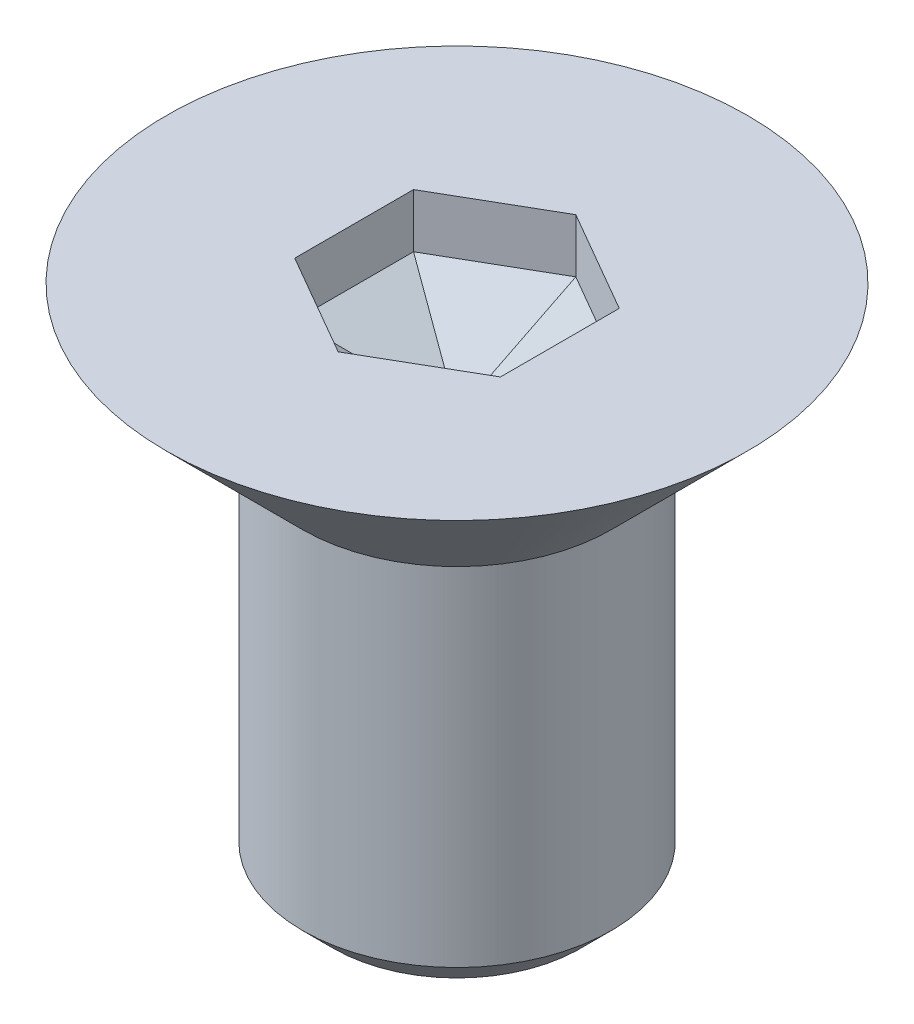
ISO-10303-21;
HEADER;
FILE_DESCRIPTION(('STEP AP214'),'2;1');
FILE_NAME('part.step','',(''),(''),'','','');
FILE_SCHEMA(('AUTOMOTIVE_DESIGN { 1 0 10303 214 1 1 1 1 }'));
ENDSEC;
DATA;
#1=APPLICATION_CONTEXT('core data for automotive mechanical design processes');
#2=APPLICATION_PROTOCOL_DEFINITION('international standard','automotive_design',2000,#1);
#3=PRODUCT_CONTEXT('',#1,'mechanical');
#4=PRODUCT('Part','Part','',(#3));
#5=PRODUCT_RELATED_PRODUCT_CATEGORY('part','',(#4));
#6=PRODUCT_DEFINITION_FORMATION('','',#4);
#7=PRODUCT_DEFINITION_CONTEXT('part definition',#1,'design');
#8=PRODUCT_DEFINITION('design','',#6,#7);
#9=PRODUCT_DEFINITION_SHAPE('','',#8);
#10=(LENGTH_UNIT() NAMED_UNIT(*) SI_UNIT(.MILLI.,.METRE.));
#11=(NAMED_UNIT(*) PLANE_ANGLE_UNIT() SI_UNIT($,.RADIAN.));
#12=(NAMED_UNIT(*) SI_UNIT($,.STERADIAN.) SOLID_ANGLE_UNIT());
#13=UNCERTAINTY_MEASURE_WITH_UNIT(LENGTH_MEASURE(1.E-05),#10,'distance_accuracy_value','');
#14=(GEOMETRIC_REPRESENTATION_CONTEXT(3) GLOBAL_UNCERTAINTY_ASSIGNED_CONTEXT((#13)) GLOBAL_UNIT_ASSIGNED_CONTEXT((#10,
#11,#12)) REPRESENTATION_CONTEXT('',''));
#15=CARTESIAN_POINT('',(0.,0.,0.));
#16=DIRECTION('',(0.,0.,1.));
#17=DIRECTION('',(1.,0.,0.));
#18=AXIS2_PLACEMENT_3D('',#15,#16,#17);
#19=CARTESIAN_POINT('',(0.,-3.72,0.));
#20=DIRECTION('',(0.,1.,0.));
#21=DIRECTION('',(0.,0.,1.));
#22=AXIS2_PLACEMENT_3D('',#19,#20,#21);
#23=CONICAL_SURFACE('',#22,1.93000000000004,0.785398163397443);
#24=CARTESIAN_POINT('',(0.,0.,0.));
#25=DIRECTION('',(0.,-1.,0.));
#26=DIRECTION('',(0.,0.,-1.));
#27=AXIS2_PLACEMENT_3D('',#24,#25,#26);
#28=CIRCLE('',#27,5.65);
#29=CARTESIAN_POINT('',(0.,0.,-5.65));
#30=VERTEX_POINT('',#29);
#31=EDGE_CURVE('E156',#30,#30,#28,.T.);
#32=ORIENTED_EDGE('',*,*,#31,.T.);
#33=EDGE_LOOP('',(#32));
#34=FACE_BOUND('',#33,.T.);
#35=CARTESIAN_POINT('',(0.,-2.65000000000003,0.));
#36=DIRECTION('',(0.,1.,0.));
#37=DIRECTION('',(0.,0.,1.));
#38=AXIS2_PLACEMENT_3D('',#35,#36,#37);
#39=CIRCLE('',#38,3.);
#40=CARTESIAN_POINT('',(0.,-2.65000000000003,3.));
#41=VERTEX_POINT('',#40);
#42=EDGE_CURVE('E151',#41,#41,#39,.T.);
#43=ORIENTED_EDGE('',*,*,#42,.T.);
#44=EDGE_LOOP('',(#43));
#45=FACE_BOUND('',#44,.T.);
#46=ADVANCED_FACE('F43',(#34,#45),#23,.T.);
#47=CARTESIAN_POINT('',(0.,0.,0.));
#48=DIRECTION('',(0.,1.,0.));
#49=DIRECTION('',(0.,0.,1.));
#50=AXIS2_PLACEMENT_3D('',#47,#48,#49);
#51=PLANE('',#50);
#52=DIRECTION('',(0.,0.,-1.));
#53=VECTOR('',#52,1.);
#54=CARTESIAN_POINT('',(2.,0.,1.15470053837925));
#55=LINE('',#54,#53);
#56=CARTESIAN_POINT('',(2.,0.,1.15470053837925));
#57=VERTEX_POINT('',#56);
#58=CARTESIAN_POINT('',(2.,0.,-1.15470053837925));
#59=VERTEX_POINT('',#58);
#60=EDGE_CURVE('E132',#57,#59,#55,.T.);
#61=ORIENTED_EDGE('',*,*,#60,.F.);
#62=DIRECTION('',(0.866025403784439,0.,-0.5));
#63=VECTOR('',#62,1.);
#64=CARTESIAN_POINT('',(0.,0.,2.30940107675851));
#65=LINE('',#64,#63);
#66=CARTESIAN_POINT('',(0.,0.,2.30940107675851));
#67=VERTEX_POINT('',#66);
#68=EDGE_CURVE('E148',#67,#57,#65,.T.);
#69=ORIENTED_EDGE('',*,*,#68,.F.);
#70=DIRECTION('',(0.866025403784438,0.,0.5));
#71=VECTOR('',#70,1.);
#72=CARTESIAN_POINT('',(-2.,0.,1.15470053837925));
#73=LINE('',#72,#71);
#74=CARTESIAN_POINT('',(-2.,0.,1.15470053837925));
#75=VERTEX_POINT('',#74);
#76=EDGE_CURVE('E137',#75,#67,#73,.T.);
#77=ORIENTED_EDGE('',*,*,#76,.F.);
#78=DIRECTION('',(0.,0.,1.));
#79=VECTOR('',#78,1.);
#80=CARTESIAN_POINT('',(-2.,0.,-1.15470053837925));
#81=LINE('',#80,#79);
#82=CARTESIAN_POINT('',(-2.,0.,-1.15470053837925));
#83=VERTEX_POINT('',#82);
#84=EDGE_CURVE('E136',#83,#75,#81,.T.);
#85=ORIENTED_EDGE('',*,*,#84,.F.);
#86=DIRECTION('',(-0.866025403784439,0.,0.5));
#87=VECTOR('',#86,1.);
#88=CARTESIAN_POINT('',(0.,0.,-2.3094010767585));
#89=LINE('',#88,#87);
#90=CARTESIAN_POINT('',(0.,0.,-2.3094010767585));
#91=VERTEX_POINT('',#90);
#92=EDGE_CURVE('E118',#91,#83,#89,.T.);
#93=ORIENTED_EDGE('',*,*,#92,.F.);
#94=DIRECTION('',(-0.866025403784439,0.,-0.5));
#95=VECTOR('',#94,1.);
#96=CARTESIAN_POINT('',(2.,0.,-1.15470053837925));
#97=LINE('',#96,#95);
#98=EDGE_CURVE('E129',#59,#91,#97,.T.);
#99=ORIENTED_EDGE('',*,*,#98,.F.);
#100=EDGE_LOOP('',(#61,#69,#77,#85,#93,#99));
#101=FACE_BOUND('',#100,.T.);
#102=ORIENTED_EDGE('',*,*,#31,.F.);
#103=EDGE_LOOP('',(#102));
#104=FACE_BOUND('',#103,.T.);
#105=ADVANCED_FACE('F133',(#101,#104),#51,.T.);
#106=CARTESIAN_POINT('',(0.,-10.,0.));
#107=DIRECTION('',(0.,1.,0.));
#108=DIRECTION('',(0.,0.,1.));
#109=AXIS2_PLACEMENT_3D('',#106,#107,#108);
#110=CYLINDRICAL_SURFACE('',#109,3.);
#111=CARTESIAN_POINT('',(0.,-9.4,0.));
#112=DIRECTION('',(0.,-1.,0.));
#113=DIRECTION('',(0.,0.,-1.));
#114=AXIS2_PLACEMENT_3D('',#111,#112,#113);
#115=CIRCLE('',#114,3.);
#116=CARTESIAN_POINT('',(0.,-9.4,3.));
#117=VERTEX_POINT('',#116);
#118=EDGE_CURVE('E11',#117,#117,#115,.F.);
#119=ORIENTED_EDGE('',*,*,#118,.T.);
#120=EDGE_LOOP('',(#119));
#121=FACE_BOUND('',#120,.T.);
#122=ORIENTED_EDGE('',*,*,#42,.F.);
#123=EDGE_LOOP('',(#122));
#124=FACE_BOUND('',#123,.T.);
#125=ADVANCED_FACE('F221',(#121,#124),#110,.T.);
#126=CARTESIAN_POINT('',(0.,-10.,0.));
#127=DIRECTION('',(0.,-1.,0.));
#128=DIRECTION('',(0.,0.,-1.));
#129=AXIS2_PLACEMENT_3D('',#126,#127,#128);
#130=PLANE('',#129);
#131=CARTESIAN_POINT('',(0.,-10.,0.));
#132=DIRECTION('',(0.,-1.,0.));
#133=DIRECTION('',(0.,0.,-1.));
#134=AXIS2_PLACEMENT_3D('',#131,#132,#133);
#135=CIRCLE('',#134,2.4);
#136=CARTESIAN_POINT('',(0.,-10.,2.4));
#137=VERTEX_POINT('',#136);
#138=EDGE_CURVE('E51',#137,#137,#135,.T.);
#139=ORIENTED_EDGE('',*,*,#138,.T.);
#140=EDGE_LOOP('',(#139));
#141=FACE_BOUND('',#140,.T.);
#142=ADVANCED_FACE('F204',(#141),#130,.T.);
#143=CARTESIAN_POINT('',(2.,-2.2,1.15470053837925));
#144=DIRECTION('',(1.,0.,0.));
#145=DIRECTION('',(0.,0.,-1.));
#146=AXIS2_PLACEMENT_3D('',#143,#144,#145);
#147=PLANE('',#146);
#148=DIRECTION('',(0.,1.,0.));
#149=VECTOR('',#148,1.);
#150=CARTESIAN_POINT('',(2.,-2.2,-1.15470053837925));
#151=LINE('',#150,#149);
#152=CARTESIAN_POINT('',(2.,-1.04726224783862,-1.15470053837925));
#153=VERTEX_POINT('',#152);
#154=EDGE_CURVE('E121',#153,#59,#151,.T.);
#155=ORIENTED_EDGE('',*,*,#154,.F.);
#156=DIRECTION('',(0.,0.,1.));
#157=VECTOR('',#156,1.);
#158=CARTESIAN_POINT('',(2.,-1.04726224783862,1.15470053837925));
#159=LINE('',#158,#157);
#160=CARTESIAN_POINT('',(2.,-1.04726224783862,1.15470053837925));
#161=VERTEX_POINT('',#160);
#162=EDGE_CURVE('E61',#153,#161,#159,.T.);
#163=ORIENTED_EDGE('',*,*,#162,.T.);
#164=DIRECTION('',(0.,1.,0.));
#165=VECTOR('',#164,1.);
#166=CARTESIAN_POINT('',(2.,-2.2,1.15470053837925));
#167=LINE('',#166,#165);
#168=EDGE_CURVE('E150',#161,#57,#167,.T.);
#169=ORIENTED_EDGE('',*,*,#168,.T.);
#170=ORIENTED_EDGE('',*,*,#60,.T.);
#171=EDGE_LOOP('',(#155,#163,#169,#170));
#172=FACE_BOUND('',#171,.T.);
#173=ADVANCED_FACE('F278',(#172),#147,.F.);
#174=CARTESIAN_POINT('',(0.,-2.2,2.30940107675851));
#175=DIRECTION('',(0.5,0.,0.866025403784439));
#176=DIRECTION('',(0.866025403784439,0.,-0.5));
#177=AXIS2_PLACEMENT_3D('',#174,#175,#176);
#178=PLANE('',#177);
#179=ORIENTED_EDGE('',*,*,#168,.F.);
#180=DIRECTION('',(-0.866025403784439,0.,0.5));
#181=VECTOR('',#180,1.);
#182=CARTESIAN_POINT('',(0.,-1.04726224783862,2.30940107675851));
#183=LINE('',#182,#181);
#184=CARTESIAN_POINT('',(0.,-1.04726224783862,2.30940107675851));
#185=VERTEX_POINT('',#184);
#186=EDGE_CURVE('E185',#161,#185,#183,.T.);
#187=ORIENTED_EDGE('',*,*,#186,.T.);
#188=DIRECTION('',(0.,1.,0.));
#189=VECTOR('',#188,1.);
#190=CARTESIAN_POINT('',(0.,-2.2,2.30940107675851));
#191=LINE('',#190,#189);
#192=EDGE_CURVE('E152',#185,#67,#191,.T.);
#193=ORIENTED_EDGE('',*,*,#192,.T.);
#194=ORIENTED_EDGE('',*,*,#68,.T.);
#195=EDGE_LOOP('',(#179,#187,#193,#194));
#196=FACE_BOUND('',#195,.T.);
#197=ADVANCED_FACE('F262',(#196),#178,.F.);
#198=CARTESIAN_POINT('',(-2.,-2.2,1.15470053837925));
#199=DIRECTION('',(-0.5,0.,0.866025403784438));
#200=DIRECTION('',(0.866025403784439,0.,0.5));
#201=AXIS2_PLACEMENT_3D('',#198,#199,#200);
#202=PLANE('',#201);
#203=ORIENTED_EDGE('',*,*,#192,.F.);
#204=DIRECTION('',(-0.866025403784439,0.,-0.5));
#205=VECTOR('',#204,1.);
#206=CARTESIAN_POINT('',(-2.,-1.04726224783862,1.15470053837925));
#207=LINE('',#206,#205);
#208=CARTESIAN_POINT('',(-2.,-1.04726224783862,1.15470053837925));
#209=VERTEX_POINT('',#208);
#210=EDGE_CURVE('E176',#185,#209,#207,.T.);
#211=ORIENTED_EDGE('',*,*,#210,.T.);
#212=DIRECTION('',(0.,1.,0.));
#213=VECTOR('',#212,1.);
#214=CARTESIAN_POINT('',(-2.,-2.2,1.15470053837925));
#215=LINE('',#214,#213);
#216=EDGE_CURVE('E153',#209,#75,#215,.T.);
#217=ORIENTED_EDGE('',*,*,#216,.T.);
#218=ORIENTED_EDGE('',*,*,#76,.T.);
#219=EDGE_LOOP('',(#203,#211,#217,#218));
#220=FACE_BOUND('',#219,.T.);
#221=ADVANCED_FACE('F265',(#220),#202,.F.);
#222=CARTESIAN_POINT('',(-2.,-2.2,-1.15470053837925));
#223=DIRECTION('',(-1.,0.,0.));
#224=DIRECTION('',(0.,0.,1.));
#225=AXIS2_PLACEMENT_3D('',#222,#223,#224);
#226=PLANE('',#225);
#227=ORIENTED_EDGE('',*,*,#216,.F.);
#228=DIRECTION('',(0.,0.,-1.));
#229=VECTOR('',#228,1.);
#230=CARTESIAN_POINT('',(-2.,-1.04726224783862,-1.15470053837925));
#231=LINE('',#230,#229);
#232=CARTESIAN_POINT('',(-2.,-1.04726224783862,-1.15470053837925));
#233=VERTEX_POINT('',#232);
#234=EDGE_CURVE('E177',#209,#233,#231,.T.);
#235=ORIENTED_EDGE('',*,*,#234,.T.);
#236=DIRECTION('',(0.,1.,0.));
#237=VECTOR('',#236,1.);
#238=CARTESIAN_POINT('',(-2.,-2.2,-1.15470053837925));
#239=LINE('',#238,#237);
#240=EDGE_CURVE('E124',#233,#83,#239,.T.);
#241=ORIENTED_EDGE('',*,*,#240,.T.);
#242=ORIENTED_EDGE('',*,*,#84,.T.);
#243=EDGE_LOOP('',(#227,#235,#241,#242));
#244=FACE_BOUND('',#243,.T.);
#245=ADVANCED_FACE('F274',(#244),#226,.F.);
#246=CARTESIAN_POINT('',(0.,-2.2,-2.3094010767585));
#247=DIRECTION('',(-0.5,0.,-0.866025403784439));
#248=DIRECTION('',(-0.866025403784439,0.,0.5));
#249=AXIS2_PLACEMENT_3D('',#246,#247,#248);
#250=PLANE('',#249);
#251=ORIENTED_EDGE('',*,*,#240,.F.);
#252=DIRECTION('',(0.866025403784439,0.,-0.5));
#253=VECTOR('',#252,1.);
#254=CARTESIAN_POINT('',(0.,-1.04726224783862,-2.3094010767585));
#255=LINE('',#254,#253);
#256=CARTESIAN_POINT('',(0.,-1.04726224783862,-2.3094010767585));
#257=VERTEX_POINT('',#256);
#258=EDGE_CURVE('E125',#233,#257,#255,.T.);
#259=ORIENTED_EDGE('',*,*,#258,.T.);
#260=DIRECTION('',(0.,1.,0.));
#261=VECTOR('',#260,1.);
#262=CARTESIAN_POINT('',(0.,-2.2,-2.3094010767585));
#263=LINE('',#262,#261);
#264=EDGE_CURVE('E112',#257,#91,#263,.T.);
#265=ORIENTED_EDGE('',*,*,#264,.T.);
#266=ORIENTED_EDGE('',*,*,#92,.T.);
#267=EDGE_LOOP('',(#251,#259,#265,#266));
#268=FACE_BOUND('',#267,.T.);
#269=ADVANCED_FACE('F120',(#268),#250,.F.);
#270=CARTESIAN_POINT('',(2.,-2.2,-1.15470053837925));
#271=DIRECTION('',(0.5,0.,-0.866025403784438));
#272=DIRECTION('',(-0.866025403784439,0.,-0.5));
#273=AXIS2_PLACEMENT_3D('',#270,#271,#272);
#274=PLANE('',#273);
#275=ORIENTED_EDGE('',*,*,#264,.F.);
#276=DIRECTION('',(0.866025403784439,0.,0.5));
#277=VECTOR('',#276,1.);
#278=CARTESIAN_POINT('',(2.,-1.04726224783862,-1.15470053837925));
#279=LINE('',#278,#277);
#280=EDGE_CURVE('E59',#257,#153,#279,.T.);
#281=ORIENTED_EDGE('',*,*,#280,.T.);
#282=ORIENTED_EDGE('',*,*,#154,.T.);
#283=ORIENTED_EDGE('',*,*,#98,.T.);
#284=EDGE_LOOP('',(#275,#281,#282,#283));
#285=FACE_BOUND('',#284,.T.);
#286=ADVANCED_FACE('F127',(#285),#274,.F.);
#287=CARTESIAN_POINT('',(0.,-2.2,0.));
#288=DIRECTION('',(0.,1.,0.));
#289=DIRECTION('',(0.,0.,1.));
#290=AXIS2_PLACEMENT_3D('',#287,#288,#289);
#291=PLANE('',#290);
#292=DIRECTION('',(0.,0.,1.));
#293=VECTOR('',#292,1.);
#294=CARTESIAN_POINT('',(-0.00339964545371246,-2.2,0.));
#295=LINE('',#294,#293);
#296=CARTESIAN_POINT('',(-0.00339964545371252,-2.2,-0.00196278621784765));
#297=VERTEX_POINT('',#296);
#298=CARTESIAN_POINT('',(-0.00339964545371246,-2.2,0.00196278621785234));
#299=VERTEX_POINT('',#298);
#300=EDGE_CURVE('E171',#297,#299,#295,.T.);
#301=ORIENTED_EDGE('',*,*,#300,.T.);
#302=DIRECTION('',(0.866025403784439,0.,0.5));
#303=VECTOR('',#302,1.);
#304=CARTESIAN_POINT('',(-0.00169982272685715,-2.2,0.00294417932677686));
#305=LINE('',#304,#303);
#306=CARTESIAN_POINT('',(0.,-2.2,0.003925572435702));
#307=VERTEX_POINT('',#306);
#308=EDGE_CURVE('E173',#299,#307,#305,.T.);
#309=ORIENTED_EDGE('',*,*,#308,.T.);
#310=DIRECTION('',(0.866025403784439,0.,-0.5));
#311=VECTOR('',#310,1.);
#312=CARTESIAN_POINT('',(0.00169982272685672,-2.2,0.00294417932677611));
#313=LINE('',#312,#311);
#314=CARTESIAN_POINT('',(0.00339964545371203,-2.2,0.00196278621785155));
#315=VERTEX_POINT('',#314);
#316=EDGE_CURVE('E170',#307,#315,#313,.T.);
#317=ORIENTED_EDGE('',*,*,#316,.T.);
#318=DIRECTION('',(0.,0.,-1.));
#319=VECTOR('',#318,1.);
#320=CARTESIAN_POINT('',(0.00339964545371203,-2.2,0.));
#321=LINE('',#320,#319);
#322=CARTESIAN_POINT('',(0.00339964545371203,-2.2,-0.00196278621784983));
#323=VERTEX_POINT('',#322);
#324=EDGE_CURVE('E164',#315,#323,#321,.T.);
#325=ORIENTED_EDGE('',*,*,#324,.T.);
#326=DIRECTION('',(-0.866025403784439,0.,-0.5));
#327=VECTOR('',#326,1.);
#328=CARTESIAN_POINT('',(0.00169982272685596,-2.2,-0.0029441793267748));
#329=LINE('',#328,#327);
#330=CARTESIAN_POINT('',(0.,-2.2,-0.00392557243569888));
#331=VERTEX_POINT('',#330);
#332=EDGE_CURVE('E163',#323,#331,#329,.T.);
#333=ORIENTED_EDGE('',*,*,#332,.T.);
#334=DIRECTION('',(-0.866025403784439,0.,0.5));
#335=VECTOR('',#334,1.);
#336=CARTESIAN_POINT('',(-0.00169982272685515,-2.2,-0.00294417932677339));
#337=LINE('',#336,#335);
#338=EDGE_CURVE('E169',#331,#297,#337,.T.);
#339=ORIENTED_EDGE('',*,*,#338,.T.);
#340=EDGE_LOOP('',(#301,#309,#317,#325,#333,#339));
#341=FACE_BOUND('',#340,.T.);
#342=ADVANCED_FACE('F244',(#341),#291,.T.);
#343=CARTESIAN_POINT('',(0.00169982272685596,-2.2,-0.0029441793267748));
#344=DIRECTION('',(0.249999999999997,-0.866025403784442,-0.433012701892215));
#345=DIRECTION('',(-0.866025403784439,0.,-0.5));
#346=AXIS2_PLACEMENT_3D('',#343,#344,#345);
#347=PLANE('',#346);
#348=DIRECTION('',(0.774596669241486,0.447213595499953,-0.447213595499959));
#349=VECTOR('',#348,1.);
#350=CARTESIAN_POINT('',(0.00271971636296966,-2.20039255724357,-0.00157022897427984));
#351=LINE('',#350,#349);
#352=EDGE_CURVE('E196',#153,#323,#351,.F.);
#353=ORIENTED_EDGE('',*,*,#352,.F.);
#354=ORIENTED_EDGE('',*,*,#280,.F.);
#355=DIRECTION('',(0.,-0.447213595499953,0.894427190999919));
#356=VECTOR('',#355,1.);
#357=CARTESIAN_POINT('',(0.,-2.20039255724357,-0.00314045794855846));
#358=LINE('',#357,#356);
#359=EDGE_CURVE('E198',#331,#257,#358,.F.);
#360=ORIENTED_EDGE('',*,*,#359,.F.);
#361=ORIENTED_EDGE('',*,*,#332,.F.);
#362=EDGE_LOOP('',(#353,#354,#360,#361));
#363=FACE_BOUND('',#362,.T.);
#364=ADVANCED_FACE('F245',(#363),#347,.F.);
#365=CARTESIAN_POINT('',(-0.00169982272685515,-2.2,-0.00294417932677339));
#366=DIRECTION('',(-0.249999999999997,-0.866025403784442,-0.433012701892214));
#367=DIRECTION('',(-0.866025403784439,0.,0.5));
#368=AXIS2_PLACEMENT_3D('',#365,#366,#367);
#369=PLANE('',#368);
#370=ORIENTED_EDGE('',*,*,#359,.T.);
#371=ORIENTED_EDGE('',*,*,#258,.F.);
#372=DIRECTION('',(0.774596669241486,-0.447213595499953,0.447213595499959));
#373=VECTOR('',#372,1.);
#374=CARTESIAN_POINT('',(-0.00271971636297083,-2.20039255724357,-0.00157022897427814));
#375=LINE('',#374,#373);
#376=EDGE_CURVE('E192',#297,#233,#375,.F.);
#377=ORIENTED_EDGE('',*,*,#376,.F.);
#378=ORIENTED_EDGE('',*,*,#338,.F.);
#379=EDGE_LOOP('',(#370,#371,#377,#378));
#380=FACE_BOUND('',#379,.T.);
#381=ADVANCED_FACE('F237',(#380),#369,.F.);
#382=CARTESIAN_POINT('',(0.00339964545371203,-2.2,0.));
#383=DIRECTION('',(0.499999999999994,-0.866025403784442,0.));
#384=DIRECTION('',(0.,0.,-1.));
#385=AXIS2_PLACEMENT_3D('',#382,#383,#384);
#386=PLANE('',#385);
#387=ORIENTED_EDGE('',*,*,#352,.T.);
#388=ORIENTED_EDGE('',*,*,#324,.F.);
#389=DIRECTION('',(0.774596669241486,0.447213595499953,0.44721359549996));
#390=VECTOR('',#389,1.);
#391=CARTESIAN_POINT('',(0.00271971636296988,-2.20039255724357,0.00157022897428159));
#392=LINE('',#391,#390);
#393=EDGE_CURVE('E188',#161,#315,#392,.F.);
#394=ORIENTED_EDGE('',*,*,#393,.F.);
#395=ORIENTED_EDGE('',*,*,#162,.F.);
#396=EDGE_LOOP('',(#387,#388,#394,#395));
#397=FACE_BOUND('',#396,.T.);
#398=ADVANCED_FACE('F232',(#397),#386,.F.);
#399=CARTESIAN_POINT('',(-0.00339964545371246,-2.2,0.));
#400=DIRECTION('',(-0.499999999999994,-0.866025403784442,0.));
#401=DIRECTION('',(0.,0.,1.));
#402=AXIS2_PLACEMENT_3D('',#399,#400,#401);
#403=PLANE('',#402);
#404=ORIENTED_EDGE('',*,*,#376,.T.);
#405=ORIENTED_EDGE('',*,*,#234,.F.);
#406=DIRECTION('',(0.774596669241486,-0.447213595499953,-0.447213595499959));
#407=VECTOR('',#406,1.);
#408=CARTESIAN_POINT('',(-0.00271971636297029,-2.20039255724357,0.00157022897428221));
#409=LINE('',#408,#407);
#410=EDGE_CURVE('E189',#299,#209,#409,.F.);
#411=ORIENTED_EDGE('',*,*,#410,.F.);
#412=ORIENTED_EDGE('',*,*,#300,.F.);
#413=EDGE_LOOP('',(#404,#405,#411,#412));
#414=FACE_BOUND('',#413,.T.);
#415=ADVANCED_FACE('F233',(#414),#403,.F.);
#416=CARTESIAN_POINT('',(0.00169982272685667,-2.2,0.00294417932677602));
#417=DIRECTION('',(0.249999999999997,-0.866025403784442,0.433012701892214));
#418=DIRECTION('',(0.866025403784439,0.,-0.5));
#419=AXIS2_PLACEMENT_3D('',#416,#417,#418);
#420=PLANE('',#419);
#421=ORIENTED_EDGE('',*,*,#393,.T.);
#422=ORIENTED_EDGE('',*,*,#316,.F.);
#423=DIRECTION('',(0.,0.447213595499953,0.894427190999919));
#424=VECTOR('',#423,1.);
#425=CARTESIAN_POINT('',(0.,-2.20039255724357,0.00314045794856169));
#426=LINE('',#425,#424);
#427=EDGE_CURVE('E187',#185,#307,#426,.F.);
#428=ORIENTED_EDGE('',*,*,#427,.F.);
#429=ORIENTED_EDGE('',*,*,#186,.F.);
#430=EDGE_LOOP('',(#421,#422,#428,#429));
#431=FACE_BOUND('',#430,.T.);
#432=ADVANCED_FACE('F212',(#431),#420,.F.);
#433=CARTESIAN_POINT('',(-0.00169982272685705,-2.2,0.00294417932677668));
#434=DIRECTION('',(-0.249999999999997,-0.866025403784442,0.433012701892214));
#435=DIRECTION('',(0.866025403784439,0.,0.5));
#436=AXIS2_PLACEMENT_3D('',#433,#434,#435);
#437=PLANE('',#436);
#438=ORIENTED_EDGE('',*,*,#410,.T.);
#439=ORIENTED_EDGE('',*,*,#210,.F.);
#440=ORIENTED_EDGE('',*,*,#427,.T.);
#441=ORIENTED_EDGE('',*,*,#308,.F.);
#442=EDGE_LOOP('',(#438,#439,#440,#441));
#443=FACE_BOUND('',#442,.T.);
#444=ADVANCED_FACE('F210',(#443),#437,.F.);
#445=CARTESIAN_POINT('',(0.,-10.,0.));
#446=DIRECTION('',(0.,1.,0.));
#447=DIRECTION('',(0.,0.,1.));
#448=AXIS2_PLACEMENT_3D('',#445,#446,#447);
#449=CONICAL_SURFACE('',#448,2.4,0.785398163397447);
#450=CARTESIAN_POINT('',(0.,-9.4,3.));
#451=CARTESIAN_POINT('',(0.,-9.40625,2.99375));
#452=CARTESIAN_POINT('',(0.,-9.4125,2.9875));
#453=CARTESIAN_POINT('',(0.,-9.425,2.975));
#454=CARTESIAN_POINT('',(0.,-9.43125,2.96875));
#455=CARTESIAN_POINT('',(0.,-9.44375,2.95625));
#456=CARTESIAN_POINT('',(0.,-9.45,2.95));
#457=CARTESIAN_POINT('',(0.,-9.4625,2.9375));
#458=CARTESIAN_POINT('',(0.,-9.46875,2.93125));
#459=CARTESIAN_POINT('',(0.,-9.48125,2.91875));
#460=CARTESIAN_POINT('',(0.,-9.4875,2.9125));
#461=CARTESIAN_POINT('',(0.,-9.5,2.9));
#462=CARTESIAN_POINT('',(0.,-9.50625,2.89375));
#463=CARTESIAN_POINT('',(0.,-9.51875,2.88125));
#464=CARTESIAN_POINT('',(0.,-9.525,2.875));
#465=CARTESIAN_POINT('',(0.,-9.5375,2.8625));
#466=CARTESIAN_POINT('',(0.,-9.54375,2.85625));
#467=CARTESIAN_POINT('',(0.,-9.55625,2.84375));
#468=CARTESIAN_POINT('',(0.,-9.5625,2.8375));
#469=CARTESIAN_POINT('',(0.,-9.575,2.825));
#470=CARTESIAN_POINT('',(0.,-9.58125,2.81875));
#471=CARTESIAN_POINT('',(0.,-9.59375,2.80625));
#472=CARTESIAN_POINT('',(0.,-9.6,2.8));
#473=CARTESIAN_POINT('',(0.,-9.6125,2.7875));
#474=CARTESIAN_POINT('',(0.,-9.61875,2.78125));
#475=CARTESIAN_POINT('',(0.,-9.63125,2.76875));
#476=CARTESIAN_POINT('',(0.,-9.6375,2.7625));
#477=CARTESIAN_POINT('',(0.,-9.65,2.75));
#478=CARTESIAN_POINT('',(0.,-9.65625,2.74375));
#479=CARTESIAN_POINT('',(0.,-9.66875,2.73125));
#480=CARTESIAN_POINT('',(0.,-9.675,2.725));
#481=CARTESIAN_POINT('',(0.,-9.6875,2.7125));
#482=CARTESIAN_POINT('',(0.,-9.69375,2.70625));
#483=CARTESIAN_POINT('',(0.,-9.70625,2.69375));
#484=CARTESIAN_POINT('',(0.,-9.7125,2.6875));
#485=CARTESIAN_POINT('',(0.,-9.725,2.675));
#486=CARTESIAN_POINT('',(0.,-9.73125,2.66875));
#487=CARTESIAN_POINT('',(0.,-9.74375,2.65625));
#488=CARTESIAN_POINT('',(0.,-9.75,2.65));
#489=CARTESIAN_POINT('',(0.,-9.7625,2.6375));
#490=CARTESIAN_POINT('',(0.,-9.76875,2.63125));
#491=CARTESIAN_POINT('',(0.,-9.78125,2.61875));
#492=CARTESIAN_POINT('',(0.,-9.7875,2.6125));
#493=CARTESIAN_POINT('',(0.,-9.8,2.6));
#494=CARTESIAN_POINT('',(0.,-9.80625,2.59375));
#495=CARTESIAN_POINT('',(0.,-9.81875,2.58125));
#496=CARTESIAN_POINT('',(0.,-9.825,2.575));
#497=CARTESIAN_POINT('',(0.,-9.8375,2.5625));
#498=CARTESIAN_POINT('',(0.,-9.84375,2.55625));
#499=CARTESIAN_POINT('',(0.,-9.85625,2.54375));
#500=CARTESIAN_POINT('',(0.,-9.8625,2.5375));
#501=CARTESIAN_POINT('',(0.,-9.875,2.525));
#502=CARTESIAN_POINT('',(0.,-9.88125,2.51875));
#503=CARTESIAN_POINT('',(0.,-9.89375,2.50625));
#504=CARTESIAN_POINT('',(0.,-9.9,2.5));
#505=CARTESIAN_POINT('',(0.,-9.9125,2.4875));
#506=CARTESIAN_POINT('',(0.,-9.91875,2.48125));
#507=CARTESIAN_POINT('',(0.,-9.93125,2.46875));
#508=CARTESIAN_POINT('',(0.,-9.9375,2.4625));
#509=CARTESIAN_POINT('',(0.,-9.95,2.45));
#510=CARTESIAN_POINT('',(0.,-9.95625,2.44375));
#511=CARTESIAN_POINT('',(0.,-9.96875,2.43125));
#512=CARTESIAN_POINT('',(0.,-9.975,2.425));
#513=CARTESIAN_POINT('',(0.,-9.9875,2.4125));
#514=CARTESIAN_POINT('',(0.,-9.99375,2.40625));
#515=CARTESIAN_POINT('',(0.,-10.,2.4));
#516=B_SPLINE_CURVE_WITH_KNOTS('',3,(#450,#451,#452,#453,#454,#455,#456,#457,#458,#459,#460,
#461,#462,#463,#464,#465,#466,#467,#468,#469,#470,#471,#472,#473,#474,#475,#476,#477,#478,#479,
#480,#481,#482,#483,#484,#485,#486,#487,#488,#489,#490,#491,#492,#493,#494,#495,#496,#497,#498,
#499,#500,#501,#502,#503,#504,#505,#506,#507,#508,#509,#510,#511,#512,#513,#514,#515),
.UNSPECIFIED.,.F.,.F.,(4,2,2,2,2,2,2,2,2,2,2,2,2,2,2,2,2,2,2,2,2,2,2,2,2,2,2,2,2,2,2,2,4),(0.,
0.0265165042944969,0.053033008588992,0.0795495128834874,0.106066017177983,0.132582521472479,
0.159099025766974,0.18561553006147,0.212132034355965,0.23864853865046,0.265165042944957,
0.291681547239452,0.318198051533947,0.344714555828443,0.371231060122939,0.397747564417435,
0.42426406871193,0.450780573006425,0.47729707730092,0.503813581595417,0.530330085889912,
0.556846590184407,0.583363094478903,0.609879598773399,0.636396103067894,0.66291260736239,
0.689429111656885,0.71594561595138,0.742462120245877,0.768978624540372,0.795495128834868,
0.822011633129363,0.848528137423859),.UNSPECIFIED.);
#517=EDGE_CURVE('BSEAM44',#117,#137,#516,.T.);
#518=ORIENTED_EDGE('',*,*,#118,.F.);
#519=ORIENTED_EDGE('',*,*,#138,.F.);
#520=ORIENTED_EDGE('',*,*,#517,.T.);
#521=ORIENTED_EDGE('',*,*,#517,.F.);
#522=EDGE_LOOP('',(#518,#520,#519,#521));
#523=FACE_BOUND('',#522,.T.);
#524=ADVANCED_FACE('F44',(#523),#449,.T.);
#525=CLOSED_SHELL('',(#46,#105,#125,#142,#173,#197,#221,#245,#269,#286,#342,#364,#381,#398,#415,
#432,#444,#524));
#526=MANIFOLD_SOLID_BREP('B2',#525);
#527=ADVANCED_BREP_SHAPE_REPRESENTATION('',(#18,#526),#14);
#528=SHAPE_DEFINITION_REPRESENTATION(#9,#527);
ENDSEC;
END-ISO-10303-21;
